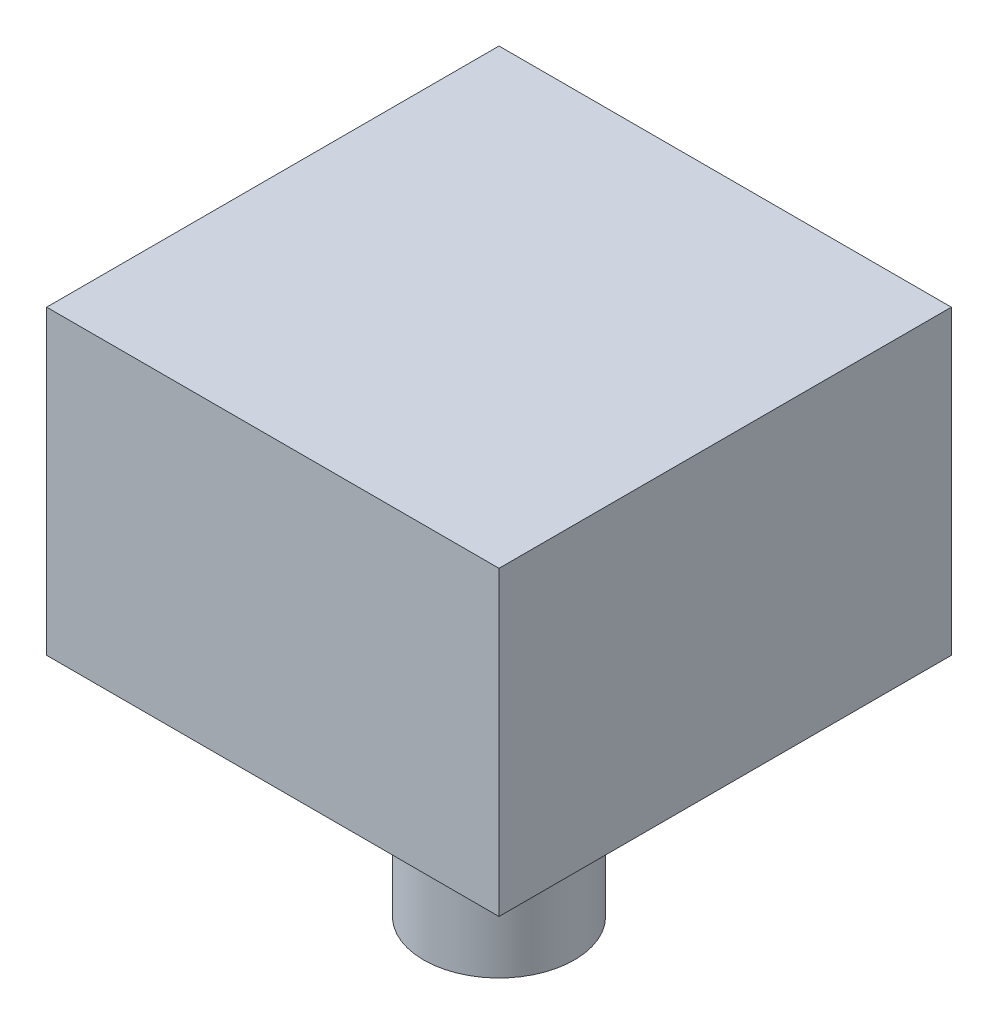
ISO-10303-21;
HEADER;
FILE_DESCRIPTION(('STEP AP214'),'2;1');
FILE_NAME('part.step','',(''),(''),'','','');
FILE_SCHEMA(('AUTOMOTIVE_DESIGN { 1 0 10303 214 1 1 1 1 }'));
ENDSEC;
DATA;
#1=APPLICATION_CONTEXT('core data for automotive mechanical design processes');
#2=APPLICATION_PROTOCOL_DEFINITION('international standard','automotive_design',2000,#1);
#3=PRODUCT_CONTEXT('',#1,'mechanical');
#4=PRODUCT('Part','Part','',(#3));
#5=PRODUCT_RELATED_PRODUCT_CATEGORY('part','',(#4));
#6=PRODUCT_DEFINITION_FORMATION('','',#4);
#7=PRODUCT_DEFINITION_CONTEXT('part definition',#1,'design');
#8=PRODUCT_DEFINITION('design','',#6,#7);
#9=PRODUCT_DEFINITION_SHAPE('','',#8);
#10=(LENGTH_UNIT() NAMED_UNIT(*) SI_UNIT(.MILLI.,.METRE.));
#11=(NAMED_UNIT(*) PLANE_ANGLE_UNIT() SI_UNIT($,.RADIAN.));
#12=(NAMED_UNIT(*) SI_UNIT($,.STERADIAN.) SOLID_ANGLE_UNIT());
#13=UNCERTAINTY_MEASURE_WITH_UNIT(LENGTH_MEASURE(1.E-05),#10,'distance_accuracy_value','');
#14=(GEOMETRIC_REPRESENTATION_CONTEXT(3) GLOBAL_UNCERTAINTY_ASSIGNED_CONTEXT((#13)) GLOBAL_UNIT_ASSIGNED_CONTEXT((#10,
#11,#12)) REPRESENTATION_CONTEXT('',''));
#15=CARTESIAN_POINT('',(0.,0.,0.));
#16=DIRECTION('',(0.,0.,1.));
#17=DIRECTION('',(1.,0.,0.));
#18=AXIS2_PLACEMENT_3D('',#15,#16,#17);
#19=CARTESIAN_POINT('',(-6.16052451832471,3.35790192670115,23.8394754816753));
#20=DIRECTION('',(-1.,0.,0.));
#21=DIRECTION('',(0.,0.,1.));
#22=AXIS2_PLACEMENT_3D('',#19,#20,#21);
#23=PLANE('',#22);
#24=DIRECTION('',(0.,1.,0.));
#25=VECTOR('',#24,1.);
#26=CARTESIAN_POINT('',(-6.16052451832471,3.35790192670115,5.83947548167529));
#27=LINE('',#26,#25);
#28=CARTESIAN_POINT('',(-6.16052451832471,3.35790192670115,5.83947548167529));
#29=VERTEX_POINT('',#28);
#30=CARTESIAN_POINT('',(-6.16052451832471,15.3579019267012,5.83947548167529));
#31=VERTEX_POINT('',#30);
#32=EDGE_CURVE('E99',#29,#31,#27,.T.);
#33=ORIENTED_EDGE('',*,*,#32,.T.);
#34=DIRECTION('',(0.,0.,-1.));
#35=VECTOR('',#34,1.);
#36=CARTESIAN_POINT('',(-6.16052451832471,15.3579019267012,23.8394754816753));
#37=LINE('',#36,#35);
#38=CARTESIAN_POINT('',(-6.16052451832471,15.3579019267012,23.8394754816753));
#39=VERTEX_POINT('',#38);
#40=EDGE_CURVE('E11',#39,#31,#37,.T.);
#41=ORIENTED_EDGE('',*,*,#40,.F.);
#42=DIRECTION('',(0.,1.,0.));
#43=VECTOR('',#42,1.);
#44=CARTESIAN_POINT('',(-6.16052451832471,3.35790192670115,23.8394754816753));
#45=LINE('',#44,#43);
#46=CARTESIAN_POINT('',(-6.16052451832471,3.35790192670115,23.8394754816753));
#47=VERTEX_POINT('',#46);
#48=EDGE_CURVE('E87',#47,#39,#45,.T.);
#49=ORIENTED_EDGE('',*,*,#48,.F.);
#50=DIRECTION('',(0.,0.,-1.));
#51=VECTOR('',#50,1.);
#52=CARTESIAN_POINT('',(-6.16052451832471,3.35790192670115,23.8394754816753));
#53=LINE('',#52,#51);
#54=EDGE_CURVE('E95',#47,#29,#53,.T.);
#55=ORIENTED_EDGE('',*,*,#54,.T.);
#56=EDGE_LOOP('',(#33,#41,#49,#55));
#57=FACE_BOUND('',#56,.T.);
#58=ADVANCED_FACE('F36',(#57),#23,.F.);
#59=CARTESIAN_POINT('',(-6.16052451832471,15.3579019267012,23.8394754816753));
#60=DIRECTION('',(0.,-1.,0.));
#61=DIRECTION('',(1.,0.,0.));
#62=AXIS2_PLACEMENT_3D('',#59,#60,#61);
#63=PLANE('',#62);
#64=DIRECTION('',(-1.,0.,0.));
#65=VECTOR('',#64,1.);
#66=CARTESIAN_POINT('',(-6.16052451832471,15.3579019267012,5.83947548167529));
#67=LINE('',#66,#65);
#68=CARTESIAN_POINT('',(-24.1605245183247,15.3579019267011,5.83947548167529));
#69=VERTEX_POINT('',#68);
#70=EDGE_CURVE('E91',#31,#69,#67,.T.);
#71=ORIENTED_EDGE('',*,*,#70,.T.);
#72=DIRECTION('',(0.,0.,-1.));
#73=VECTOR('',#72,1.);
#74=CARTESIAN_POINT('',(-24.1605245183247,15.3579019267011,23.8394754816753));
#75=LINE('',#74,#73);
#76=CARTESIAN_POINT('',(-24.1605245183247,15.3579019267011,23.8394754816753));
#77=VERTEX_POINT('',#76);
#78=EDGE_CURVE('E44',#77,#69,#75,.T.);
#79=ORIENTED_EDGE('',*,*,#78,.F.);
#80=DIRECTION('',(-1.,0.,0.));
#81=VECTOR('',#80,1.);
#82=CARTESIAN_POINT('',(-6.16052451832471,15.3579019267012,23.8394754816753));
#83=LINE('',#82,#81);
#84=EDGE_CURVE('E82',#39,#77,#83,.T.);
#85=ORIENTED_EDGE('',*,*,#84,.F.);
#86=ORIENTED_EDGE('',*,*,#40,.T.);
#87=EDGE_LOOP('',(#71,#79,#85,#86));
#88=FACE_BOUND('',#87,.T.);
#89=ADVANCED_FACE('F90',(#88),#63,.F.);
#90=CARTESIAN_POINT('',(-24.1605245183247,3.35790192670115,23.8394754816753));
#91=DIRECTION('',(1.,0.,0.));
#92=DIRECTION('',(0.,0.,-1.));
#93=AXIS2_PLACEMENT_3D('',#90,#91,#92);
#94=PLANE('',#93);
#95=DIRECTION('',(0.,-1.,0.));
#96=VECTOR('',#95,1.);
#97=CARTESIAN_POINT('',(-24.1605245183247,3.35790192670115,5.83947548167529));
#98=LINE('',#97,#96);
#99=CARTESIAN_POINT('',(-24.1605245183247,3.35790192670115,5.83947548167529));
#100=VERTEX_POINT('',#99);
#101=EDGE_CURVE('E69',#69,#100,#98,.T.);
#102=ORIENTED_EDGE('',*,*,#101,.T.);
#103=DIRECTION('',(0.,0.,-1.));
#104=VECTOR('',#103,1.);
#105=CARTESIAN_POINT('',(-24.1605245183247,3.35790192670115,23.8394754816753));
#106=LINE('',#105,#104);
#107=CARTESIAN_POINT('',(-24.1605245183247,3.35790192670115,23.8394754816753));
#108=VERTEX_POINT('',#107);
#109=EDGE_CURVE('E92',#108,#100,#106,.T.);
#110=ORIENTED_EDGE('',*,*,#109,.F.);
#111=DIRECTION('',(0.,-1.,0.));
#112=VECTOR('',#111,1.);
#113=CARTESIAN_POINT('',(-24.1605245183247,3.35790192670115,23.8394754816753));
#114=LINE('',#113,#112);
#115=EDGE_CURVE('E85',#77,#108,#114,.T.);
#116=ORIENTED_EDGE('',*,*,#115,.F.);
#117=ORIENTED_EDGE('',*,*,#78,.T.);
#118=EDGE_LOOP('',(#102,#110,#116,#117));
#119=FACE_BOUND('',#118,.T.);
#120=ADVANCED_FACE('F93',(#119),#94,.F.);
#121=CARTESIAN_POINT('',(-6.16052451832471,3.35790192670115,23.8394754816753));
#122=DIRECTION('',(0.,1.,0.));
#123=DIRECTION('',(-1.,0.,0.));
#124=AXIS2_PLACEMENT_3D('',#121,#122,#123);
#125=PLANE('',#124);
#126=CARTESIAN_POINT('',(-18.1605245183247,3.35790192670115,11.8394754816753));
#127=DIRECTION('',(0.,1.,0.));
#128=DIRECTION('',(0.,0.,1.));
#129=AXIS2_PLACEMENT_3D('',#126,#127,#128);
#130=CIRCLE('',#129,3.);
#131=CARTESIAN_POINT('',(-18.1605245183247,3.35790192670115,14.8394754816753));
#132=VERTEX_POINT('',#131);
#133=EDGE_CURVE('E113',#132,#132,#130,.T.);
#134=ORIENTED_EDGE('',*,*,#133,.T.);
#135=EDGE_LOOP('',(#134));
#136=FACE_BOUND('',#135,.T.);
#137=DIRECTION('',(1.,0.,0.));
#138=VECTOR('',#137,1.);
#139=CARTESIAN_POINT('',(-6.16052451832471,3.35790192670115,5.83947548167529));
#140=LINE('',#139,#138);
#141=EDGE_CURVE('E75',#100,#29,#140,.T.);
#142=ORIENTED_EDGE('',*,*,#141,.T.);
#143=ORIENTED_EDGE('',*,*,#54,.F.);
#144=DIRECTION('',(1.,0.,0.));
#145=VECTOR('',#144,1.);
#146=CARTESIAN_POINT('',(-6.16052451832471,3.35790192670115,23.8394754816753));
#147=LINE('',#146,#145);
#148=EDGE_CURVE('E52',#108,#47,#147,.T.);
#149=ORIENTED_EDGE('',*,*,#148,.F.);
#150=ORIENTED_EDGE('',*,*,#109,.T.);
#151=EDGE_LOOP('',(#142,#143,#149,#150));
#152=FACE_BOUND('',#151,.T.);
#153=ADVANCED_FACE('F107',(#136,#152),#125,.F.);
#154=CARTESIAN_POINT('',(-6.16052451832471,3.35790192670115,23.8394754816753));
#155=DIRECTION('',(0.,0.,1.));
#156=DIRECTION('',(1.,0.,0.));
#157=AXIS2_PLACEMENT_3D('',#154,#155,#156);
#158=PLANE('',#157);
#159=ORIENTED_EDGE('',*,*,#48,.T.);
#160=ORIENTED_EDGE('',*,*,#84,.T.);
#161=ORIENTED_EDGE('',*,*,#115,.T.);
#162=ORIENTED_EDGE('',*,*,#148,.T.);
#163=EDGE_LOOP('',(#159,#160,#161,#162));
#164=FACE_BOUND('',#163,.T.);
#165=ADVANCED_FACE('F83',(#164),#158,.T.);
#166=CARTESIAN_POINT('',(-6.16052451832471,3.35790192670115,5.83947548167529));
#167=DIRECTION('',(0.,0.,1.));
#168=DIRECTION('',(1.,0.,0.));
#169=AXIS2_PLACEMENT_3D('',#166,#167,#168);
#170=PLANE('',#169);
#171=ORIENTED_EDGE('',*,*,#32,.F.);
#172=ORIENTED_EDGE('',*,*,#141,.F.);
#173=ORIENTED_EDGE('',*,*,#101,.F.);
#174=ORIENTED_EDGE('',*,*,#70,.F.);
#175=EDGE_LOOP('',(#171,#172,#173,#174));
#176=FACE_BOUND('',#175,.T.);
#177=ADVANCED_FACE('F110',(#176),#170,.F.);
#178=CARTESIAN_POINT('',(-18.1605245183247,-8.64209807329885,11.8394754816753));
#179=DIRECTION('',(0.,1.,0.));
#180=DIRECTION('',(0.,0.,1.));
#181=AXIS2_PLACEMENT_3D('',#178,#179,#180);
#182=CYLINDRICAL_SURFACE('',#181,3.);
#183=CARTESIAN_POINT('',(-18.1605245183247,-8.64209807329885,11.8394754816753));
#184=DIRECTION('',(0.,1.,0.));
#185=DIRECTION('',(0.,0.,1.));
#186=AXIS2_PLACEMENT_3D('',#183,#184,#185);
#187=CIRCLE('',#186,3.);
#188=CARTESIAN_POINT('',(-18.1605245183247,-8.64209807329885,14.8394754816753));
#189=VERTEX_POINT('',#188);
#190=EDGE_CURVE('E102',#189,#189,#187,.T.);
#191=ORIENTED_EDGE('',*,*,#190,.T.);
#192=EDGE_LOOP('',(#191));
#193=FACE_BOUND('',#192,.T.);
#194=ORIENTED_EDGE('',*,*,#133,.F.);
#195=EDGE_LOOP('',(#194));
#196=FACE_BOUND('',#195,.T.);
#197=ADVANCED_FACE('F119',(#193,#196),#182,.T.);
#198=CARTESIAN_POINT('',(-18.1605245183247,-8.64209807329885,11.8394754816753));
#199=DIRECTION('',(0.,1.,0.));
#200=DIRECTION('',(0.,0.,1.));
#201=AXIS2_PLACEMENT_3D('',#198,#199,#200);
#202=PLANE('',#201);
#203=ORIENTED_EDGE('',*,*,#190,.F.);
#204=EDGE_LOOP('',(#203));
#205=FACE_BOUND('',#204,.T.);
#206=ADVANCED_FACE('F122',(#205),#202,.F.);
#207=CLOSED_SHELL('',(#58,#89,#120,#153,#165,#177,#197,#206));
#208=MANIFOLD_SOLID_BREP('B2',#207);
#209=ADVANCED_BREP_SHAPE_REPRESENTATION('',(#18,#208),#14);
#210=SHAPE_DEFINITION_REPRESENTATION(#9,#209);
ENDSEC;
END-ISO-10303-21;
